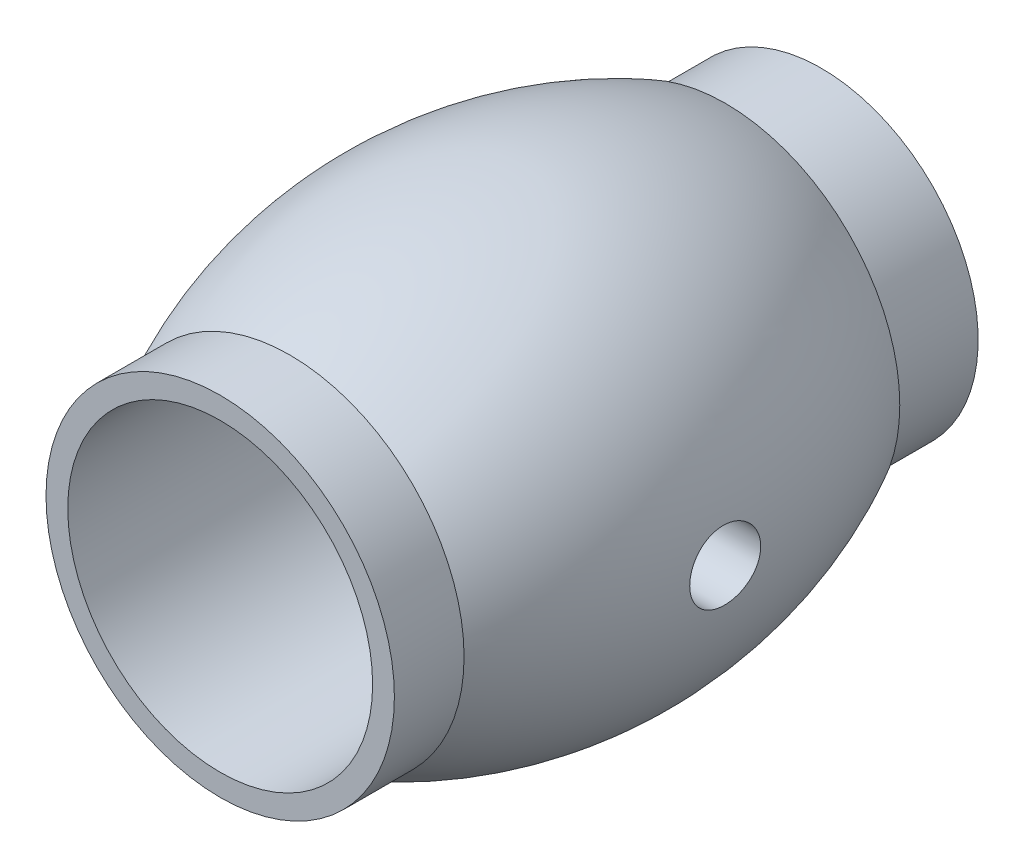
ISO-10303-21;
HEADER;
FILE_DESCRIPTION(('STEP AP214'),'2;1');
FILE_NAME('part.step','',(''),(''),'','','');
FILE_SCHEMA(('AUTOMOTIVE_DESIGN { 1 0 10303 214 1 1 1 1 }'));
ENDSEC;
DATA;
#1=APPLICATION_CONTEXT('core data for automotive mechanical design processes');
#2=APPLICATION_PROTOCOL_DEFINITION('international standard','automotive_design',2000,#1);
#3=PRODUCT_CONTEXT('',#1,'mechanical');
#4=PRODUCT('Part','Part','',(#3));
#5=PRODUCT_RELATED_PRODUCT_CATEGORY('part','',(#4));
#6=PRODUCT_DEFINITION_FORMATION('','',#4);
#7=PRODUCT_DEFINITION_CONTEXT('part definition',#1,'design');
#8=PRODUCT_DEFINITION('design','',#6,#7);
#9=PRODUCT_DEFINITION_SHAPE('','',#8);
#10=(LENGTH_UNIT() NAMED_UNIT(*) SI_UNIT(.MILLI.,.METRE.));
#11=(NAMED_UNIT(*) PLANE_ANGLE_UNIT() SI_UNIT($,.RADIAN.));
#12=(NAMED_UNIT(*) SI_UNIT($,.STERADIAN.) SOLID_ANGLE_UNIT());
#13=UNCERTAINTY_MEASURE_WITH_UNIT(LENGTH_MEASURE(1.E-05),#10,'distance_accuracy_value','');
#14=(GEOMETRIC_REPRESENTATION_CONTEXT(3) GLOBAL_UNCERTAINTY_ASSIGNED_CONTEXT((#13)) GLOBAL_UNIT_ASSIGNED_CONTEXT((#10,
#11,#12)) REPRESENTATION_CONTEXT('',''));
#15=CARTESIAN_POINT('',(0.,0.,0.));
#16=DIRECTION('',(0.,0.,1.));
#17=DIRECTION('',(1.,0.,0.));
#18=AXIS2_PLACEMENT_3D('',#15,#16,#17);
#19=CARTESIAN_POINT('',(0.,0.,-87.661385827459));
#20=DIRECTION('',(0.,0.,1.));
#21=DIRECTION('',(1.,0.,0.));
#22=AXIS2_PLACEMENT_3D('',#19,#20,#21);
#23=CYLINDRICAL_SURFACE('',#22,22.86);
#24=CARTESIAN_POINT('',(0.,0.,-87.661385827459));
#25=DIRECTION('',(0.,0.,-1.));
#26=DIRECTION('',(-1.,0.,0.));
#27=AXIS2_PLACEMENT_3D('',#24,#25,#26);
#28=CIRCLE('',#27,22.86);
#29=CARTESIAN_POINT('',(-22.86,0.,-87.661385827459));
#30=VERTEX_POINT('',#29);
#31=EDGE_CURVE('E11',#30,#30,#28,.T.);
#32=ORIENTED_EDGE('',*,*,#31,.F.);
#33=EDGE_LOOP('',(#32));
#34=FACE_BOUND('',#33,.T.);
#35=CARTESIAN_POINT('',(0.,0.,-73.691385827459));
#36=DIRECTION('',(0.,0.,-1.));
#37=DIRECTION('',(-1.,0.,0.));
#38=AXIS2_PLACEMENT_3D('',#35,#36,#37);
#39=CIRCLE('',#38,22.86);
#40=CARTESIAN_POINT('',(-22.86,0.,-73.691385827459));
#41=VERTEX_POINT('',#40);
#42=EDGE_CURVE('E57',#41,#41,#39,.T.);
#43=ORIENTED_EDGE('',*,*,#42,.T.);
#44=EDGE_LOOP('',(#43));
#45=FACE_BOUND('',#44,.T.);
#46=ADVANCED_FACE('F50',(#34,#45),#23,.T.);
#47=CARTESIAN_POINT('',(0.,0.,-87.661385827459));
#48=DIRECTION('',(0.,0.,-1.));
#49=DIRECTION('',(-1.,0.,0.));
#50=AXIS2_PLACEMENT_3D('',#47,#48,#49);
#51=PLANE('',#50);
#52=CARTESIAN_POINT('',(0.,0.,-87.661385827459));
#53=DIRECTION('',(0.,0.,-1.));
#54=DIRECTION('',(-1.,0.,0.));
#55=AXIS2_PLACEMENT_3D('',#52,#53,#54);
#56=CIRCLE('',#55,22.225);
#57=CARTESIAN_POINT('',(-22.225,0.,-87.661385827459));
#58=VERTEX_POINT('',#57);
#59=EDGE_CURVE('E63',#58,#58,#56,.T.);
#60=ORIENTED_EDGE('',*,*,#59,.F.);
#61=EDGE_LOOP('',(#60));
#62=FACE_BOUND('',#61,.T.);
#63=ORIENTED_EDGE('',*,*,#31,.T.);
#64=EDGE_LOOP('',(#63));
#65=FACE_BOUND('',#64,.T.);
#66=ADVANCED_FACE('F79',(#62,#65),#51,.T.);
#67=CARTESIAN_POINT('',(0.,0.,-73.691385827459));
#68=DIRECTION('',(0.,0.,-1.));
#69=DIRECTION('',(-1.,0.,0.));
#70=AXIS2_PLACEMENT_3D('',#67,#68,#69);
#71=PLANE('',#70);
#72=CARTESIAN_POINT('',(0.,0.,-73.691385827459));
#73=DIRECTION('',(0.,0.,-1.));
#74=DIRECTION('',(-1.,0.,0.));
#75=AXIS2_PLACEMENT_3D('',#72,#73,#74);
#76=CIRCLE('',#75,22.225);
#77=CARTESIAN_POINT('',(-22.225,0.,-73.691385827459));
#78=VERTEX_POINT('',#77);
#79=EDGE_CURVE('E53',#78,#78,#76,.T.);
#80=ORIENTED_EDGE('',*,*,#79,.T.);
#81=EDGE_LOOP('',(#80));
#82=FACE_BOUND('',#81,.T.);
#83=ORIENTED_EDGE('',*,*,#42,.F.);
#84=EDGE_LOOP('',(#83));
#85=FACE_BOUND('',#84,.T.);
#86=ADVANCED_FACE('F70',(#82,#85),#71,.F.);
#87=CARTESIAN_POINT('',(0.,0.,0.));
#88=DIRECTION('',(0.,0.,-1.));
#89=DIRECTION('',(-1.,0.,0.));
#90=AXIS2_PLACEMENT_3D('',#87,#88,#89);
#91=CYLINDRICAL_SURFACE('',#90,22.225);
#92=CARTESIAN_POINT('',(-22.225,0.,-87.661385827459));
#93=CARTESIAN_POINT('',(-22.225,0.,-87.5158649941257));
#94=CARTESIAN_POINT('',(-22.225,0.,-87.3703441607924));
#95=CARTESIAN_POINT('',(-22.225,0.,-87.0793024941257));
#96=CARTESIAN_POINT('',(-22.225,0.,-86.9337816607924));
#97=CARTESIAN_POINT('',(-22.225,0.,-86.6427399941257));
#98=CARTESIAN_POINT('',(-22.225,0.,-86.4972191607924));
#99=CARTESIAN_POINT('',(-22.225,0.,-86.2061774941257));
#100=CARTESIAN_POINT('',(-22.225,0.,-86.0606566607924));
#101=CARTESIAN_POINT('',(-22.225,0.,-85.7696149941257));
#102=CARTESIAN_POINT('',(-22.225,0.,-85.6240941607924));
#103=CARTESIAN_POINT('',(-22.225,0.,-85.3330524941257));
#104=CARTESIAN_POINT('',(-22.225,0.,-85.1875316607924));
#105=CARTESIAN_POINT('',(-22.225,0.,-84.8964899941257));
#106=CARTESIAN_POINT('',(-22.225,0.,-84.7509691607924));
#107=CARTESIAN_POINT('',(-22.225,0.,-84.4599274941257));
#108=CARTESIAN_POINT('',(-22.225,0.,-84.3144066607924));
#109=CARTESIAN_POINT('',(-22.225,0.,-84.0233649941257));
#110=CARTESIAN_POINT('',(-22.225,0.,-83.8778441607924));
#111=CARTESIAN_POINT('',(-22.225,0.,-83.5868024941257));
#112=CARTESIAN_POINT('',(-22.225,0.,-83.4412816607924));
#113=CARTESIAN_POINT('',(-22.225,0.,-83.1502399941257));
#114=CARTESIAN_POINT('',(-22.225,0.,-83.0047191607924));
#115=CARTESIAN_POINT('',(-22.225,0.,-82.7136774941257));
#116=CARTESIAN_POINT('',(-22.225,0.,-82.5681566607924));
#117=CARTESIAN_POINT('',(-22.225,0.,-82.2771149941257));
#118=CARTESIAN_POINT('',(-22.225,0.,-82.1315941607924));
#119=CARTESIAN_POINT('',(-22.225,0.,-81.8405524941257));
#120=CARTESIAN_POINT('',(-22.225,0.,-81.6950316607924));
#121=CARTESIAN_POINT('',(-22.225,0.,-81.4039899941257));
#122=CARTESIAN_POINT('',(-22.225,0.,-81.2584691607924));
#123=CARTESIAN_POINT('',(-22.225,0.,-80.9674274941257));
#124=CARTESIAN_POINT('',(-22.225,0.,-80.8219066607924));
#125=CARTESIAN_POINT('',(-22.225,0.,-80.5308649941257));
#126=CARTESIAN_POINT('',(-22.225,0.,-80.3853441607924));
#127=CARTESIAN_POINT('',(-22.225,0.,-80.0943024941257));
#128=CARTESIAN_POINT('',(-22.225,0.,-79.9487816607924));
#129=CARTESIAN_POINT('',(-22.225,0.,-79.6577399941257));
#130=CARTESIAN_POINT('',(-22.225,0.,-79.5122191607924));
#131=CARTESIAN_POINT('',(-22.225,0.,-79.2211774941257));
#132=CARTESIAN_POINT('',(-22.225,0.,-79.0756566607924));
#133=CARTESIAN_POINT('',(-22.225,0.,-78.7846149941257));
#134=CARTESIAN_POINT('',(-22.225,0.,-78.6390941607924));
#135=CARTESIAN_POINT('',(-22.225,0.,-78.3480524941257));
#136=CARTESIAN_POINT('',(-22.225,0.,-78.2025316607924));
#137=CARTESIAN_POINT('',(-22.225,0.,-77.9114899941257));
#138=CARTESIAN_POINT('',(-22.225,0.,-77.7659691607924));
#139=CARTESIAN_POINT('',(-22.225,0.,-77.4749274941257));
#140=CARTESIAN_POINT('',(-22.225,0.,-77.3294066607924));
#141=CARTESIAN_POINT('',(-22.225,0.,-77.0383649941257));
#142=CARTESIAN_POINT('',(-22.225,0.,-76.8928441607924));
#143=CARTESIAN_POINT('',(-22.225,0.,-76.6018024941257));
#144=CARTESIAN_POINT('',(-22.225,0.,-76.4562816607924));
#145=CARTESIAN_POINT('',(-22.225,0.,-76.1652399941257));
#146=CARTESIAN_POINT('',(-22.225,0.,-76.0197191607924));
#147=CARTESIAN_POINT('',(-22.225,0.,-75.7286774941257));
#148=CARTESIAN_POINT('',(-22.225,0.,-75.5831566607924));
#149=CARTESIAN_POINT('',(-22.225,0.,-75.2921149941257));
#150=CARTESIAN_POINT('',(-22.225,0.,-75.1465941607924));
#151=CARTESIAN_POINT('',(-22.225,0.,-74.8555524941257));
#152=CARTESIAN_POINT('',(-22.225,0.,-74.7100316607924));
#153=CARTESIAN_POINT('',(-22.225,0.,-74.4189899941257));
#154=CARTESIAN_POINT('',(-22.225,0.,-74.2734691607924));
#155=CARTESIAN_POINT('',(-22.225,0.,-73.9824274941257));
#156=CARTESIAN_POINT('',(-22.225,0.,-73.8369066607924));
#157=CARTESIAN_POINT('',(-22.225,0.,-73.691385827459));
#158=B_SPLINE_CURVE_WITH_KNOTS('',3,(#92,#93,#94,#95,#96,#97,#98,#99,#100,#101,#102,#103,#104,
#105,#106,#107,#108,#109,#110,#111,#112,#113,#114,#115,#116,#117,#118,#119,#120,#121,#122,#123,
#124,#125,#126,#127,#128,#129,#130,#131,#132,#133,#134,#135,#136,#137,#138,#139,#140,#141,#142,
#143,#144,#145,#146,#147,#148,#149,#150,#151,#152,#153,#154,#155,#156,#157),.UNSPECIFIED.,.F.,
.F.,(4,2,2,2,2,2,2,2,2,2,2,2,2,2,2,2,2,2,2,2,2,2,2,2,2,2,2,2,2,2,2,2,4),(0.,0.436562500000001,
0.873125000000002,1.3096875,1.74625,2.18281250000001,2.61937500000001,3.05593750000001,
3.49250000000001,3.9290625,4.365625,4.8021875,5.23875,5.6753125,6.111875,6.5484375,6.985,
7.42156250000001,7.85812500000001,8.29468750000001,8.73125000000001,9.16781250000001,
9.60437500000001,10.0409375,10.4775,10.9140625,11.350625,11.7871875,12.22375,12.6603125,
13.096875,13.5334375,13.97),.UNSPECIFIED.);
#159=EDGE_CURVE('BSEAM73',#58,#78,#158,.T.);
#160=ORIENTED_EDGE('',*,*,#59,.T.);
#161=ORIENTED_EDGE('',*,*,#79,.F.);
#162=ORIENTED_EDGE('',*,*,#159,.T.);
#163=ORIENTED_EDGE('',*,*,#159,.F.);
#164=EDGE_LOOP('',(#160,#162,#161,#163));
#165=FACE_BOUND('',#164,.T.);
#166=ADVANCED_FACE('F73',(#165),#91,.F.);
#167=CLOSED_SHELL('',(#46,#66,#86,#166));
#168=MANIFOLD_SOLID_BREP('B2',#167);
#169=CARTESIAN_POINT('',(0.,0.,-10.16));
#170=DIRECTION('',(0.,0.,1.));
#171=DIRECTION('',(1.,0.,0.));
#172=AXIS2_PLACEMENT_3D('',#169,#170,#171);
#173=CYLINDRICAL_SURFACE('',#172,25.4);
#174=CARTESIAN_POINT('',(0.,0.,-10.16));
#175=DIRECTION('',(0.,0.,1.));
#176=DIRECTION('',(1.,0.,0.));
#177=AXIS2_PLACEMENT_3D('',#174,#175,#176);
#178=CIRCLE('',#177,25.4);
#179=CARTESIAN_POINT('',(25.4,0.,-10.16));
#180=VERTEX_POINT('',#179);
#181=EDGE_CURVE('E130',#180,#180,#178,.T.);
#182=ORIENTED_EDGE('',*,*,#181,.T.);
#183=EDGE_LOOP('',(#182));
#184=FACE_BOUND('',#183,.T.);
#185=CARTESIAN_POINT('',(0.,0.,0.));
#186=DIRECTION('',(0.,0.,1.));
#187=DIRECTION('',(1.,0.,0.));
#188=AXIS2_PLACEMENT_3D('',#185,#186,#187);
#189=CIRCLE('',#188,25.4);
#190=CARTESIAN_POINT('',(25.4,0.,0.));
#191=VERTEX_POINT('',#190);
#192=EDGE_CURVE('E49',#191,#191,#189,.T.);
#193=ORIENTED_EDGE('',*,*,#192,.F.);
#194=EDGE_LOOP('',(#193));
#195=FACE_BOUND('',#194,.T.);
#196=ADVANCED_FACE('F111',(#184,#195),#173,.T.);
#197=CARTESIAN_POINT('',(0.,0.,0.));
#198=DIRECTION('',(0.,0.,1.));
#199=DIRECTION('',(1.,0.,0.));
#200=AXIS2_PLACEMENT_3D('',#197,#198,#199);
#201=PLANE('',#200);
#202=CARTESIAN_POINT('',(0.,0.,0.));
#203=DIRECTION('',(0.,0.,1.));
#204=DIRECTION('',(1.,0.,0.));
#205=AXIS2_PLACEMENT_3D('',#202,#203,#204);
#206=CIRCLE('',#205,22.225);
#207=CARTESIAN_POINT('',(22.225,0.,0.));
#208=VERTEX_POINT('',#207);
#209=EDGE_CURVE('E180',#208,#208,#206,.T.);
#210=ORIENTED_EDGE('',*,*,#209,.F.);
#211=EDGE_LOOP('',(#210));
#212=FACE_BOUND('',#211,.T.);
#213=ORIENTED_EDGE('',*,*,#192,.T.);
#214=EDGE_LOOP('',(#213));
#215=FACE_BOUND('',#214,.T.);
#216=ADVANCED_FACE('F168',(#212,#215),#201,.T.);
#217=CARTESIAN_POINT('',(0.,0.,-41.9256929137295));
#218=DIRECTION('',(0.,0.,1.));
#219=DIRECTION('',(1.,0.,0.));
#220=AXIS2_PLACEMENT_3D('',#217,#218,#219);
#221=DEGENERATE_TOROIDAL_SURFACE('',#220,35.3795784265623,68.58,.F.);
#222=CARTESIAN_POINT('',(-33.0130739266837,-2.89140779723996,-44.8168601784187));
#223=CARTESIAN_POINT('',(-33.0198908590683,-2.77440655040434,-44.8978551930183));
#224=CARTESIAN_POINT('',(-33.0264451045919,-2.6540059141496,-44.9739256980847));
#225=CARTESIAN_POINT('',(-33.0388790893021,-2.40717893275756,-45.1157285484556));
#226=CARTESIAN_POINT('',(-33.0447586667074,-2.28075115259416,-45.1814584155369));
#227=CARTESIAN_POINT('',(-33.0557059969761,-2.02269248227111,-45.3021263696417));
#228=CARTESIAN_POINT('',(-33.0607731009745,-1.89105753707689,-45.357055838995));
#229=CARTESIAN_POINT('',(-33.069970805516,-1.62355740397118,-45.4556815337727));
#230=CARTESIAN_POINT('',(-33.0741010658293,-1.48769069953535,-45.4993736789492));
#231=CARTESIAN_POINT('',(-33.0813211296492,-1.21282618370895,-45.5751558437681));
#232=CARTESIAN_POINT('',(-33.0844115994482,-1.07383043855687,-45.6072532942058));
#233=CARTESIAN_POINT('',(-33.0894821826878,-0.793560809355509,-45.6596606400304));
#234=CARTESIAN_POINT('',(-33.0914618863399,-0.652286104290409,-45.6799661851939));
#235=CARTESIAN_POINT('',(-33.094260406369,-0.368604105537237,-45.7086134967836));
#236=CARTESIAN_POINT('',(-33.0950799265178,-0.226197551205893,-45.7169625161206));
#237=CARTESIAN_POINT('',(-33.0955405713848,0.0588679506116681,-45.72165947741));
#238=CARTESIAN_POINT('',(-33.0951812617875,0.201526971762725,-45.7180029961844));
#239=CARTESIAN_POINT('',(-33.0932946884907,0.485621647673346,-45.6987335070701));
#240=CARTESIAN_POINT('',(-33.0917707300092,0.627059620961329,-45.6831543350345));
#241=CARTESIAN_POINT('',(-33.0875947335041,0.908166514854154,-45.6401857824085));
#242=CARTESIAN_POINT('',(-33.084942280105,1.04783476454754,-45.6127920530726));
#243=CARTESIAN_POINT('',(-33.0785740254225,1.32431246312791,-45.5464041456292));
#244=CARTESIAN_POINT('',(-33.0748585764044,1.4611228429928,-45.5074138103432));
#245=CARTESIAN_POINT('',(-33.0664512949954,1.73101606822113,-45.4180954646805));
#246=CARTESIAN_POINT('',(-33.0617591016802,1.86409751499437,-45.3677632627138));
#247=CARTESIAN_POINT('',(-33.0515083357815,2.1256064284102,-45.2561043758834));
#248=CARTESIAN_POINT('',(-33.0459493496054,2.25403163707192,-45.1947724403541));
#249=CARTESIAN_POINT('',(-33.0340961700725,2.50530410689886,-45.0615477010832));
#250=CARTESIAN_POINT('',(-33.0278017064585,2.62814929446521,-44.9896510127183));
#251=CARTESIAN_POINT('',(-33.0146286345407,2.86731829066866,-44.8358411340637));
#252=CARTESIAN_POINT('',(-33.0077502304351,2.983644355548,-44.7539314408506));
#253=CARTESIAN_POINT('',(-32.99356747464,3.20902252410367,-44.5806620897802));
#254=CARTESIAN_POINT('',(-32.986262966124,3.31807191756102,-44.4892989429137));
#255=CARTESIAN_POINT('',(-32.9639043893602,3.63392356108231,-44.2012118343957));
#256=CARTESIAN_POINT('',(-32.9484484346408,3.82867271584181,-43.9909773960849));
#257=CARTESIAN_POINT('',(-32.9179001745085,4.18004296668688,-43.5409081690271));
#258=CARTESIAN_POINT('',(-32.9028078733548,4.33666361640443,-43.3010730337962));
#259=CARTESIAN_POINT('',(-32.8742671412942,4.60777317311,-42.7979155135039));
#260=CARTESIAN_POINT('',(-32.860822010726,4.72217838884974,-42.534547745103));
#261=CARTESIAN_POINT('',(-32.8367199451189,4.90508151257545,-41.9922147639142));
#262=CARTESIAN_POINT('',(-32.8260629678046,4.97358011664677,-41.7132497876975));
#263=CARTESIAN_POINT('',(-32.8083302063953,5.06256147434866,-41.1483514547443));
#264=CARTESIAN_POINT('',(-32.80124570531,5.08316155070656,-40.8624368616462));
#265=CARTESIAN_POINT('',(-32.7909738519424,5.07605187818183,-40.2911412005723));
#266=CARTESIAN_POINT('',(-32.7877864256182,5.0483430471621,-40.0057601225631));
#267=CARTESIAN_POINT('',(-32.7852239953296,4.94554207087491,-39.4445237931016));
#268=CARTESIAN_POINT('',(-32.785837739531,4.87059036021075,-39.1686428559452));
#269=CARTESIAN_POINT('',(-32.7903464252715,4.67556412746428,-38.6333498845095));
#270=CARTESIAN_POINT('',(-32.7942413802389,4.55548942071744,-38.3739379176341));
#271=CARTESIAN_POINT('',(-32.8044647910859,4.27356600648417,-37.8787983849985));
#272=CARTESIAN_POINT('',(-32.8107943960713,4.11169758508285,-37.6430820694732));
#273=CARTESIAN_POINT('',(-32.8247999805953,3.75079621829388,-37.2021070403812));
#274=CARTESIAN_POINT('',(-32.8324759802112,3.55176271870172,-36.9968487810862));
#275=CARTESIAN_POINT('',(-32.8480038209813,3.12163378812073,-36.6221212946285));
#276=CARTESIAN_POINT('',(-32.8558560318815,2.89046435363547,-36.4527370184674));
#277=CARTESIAN_POINT('',(-32.8705625882016,2.40295040490589,-36.1551605724245));
#278=CARTESIAN_POINT('',(-32.8774169327682,2.14660586913493,-36.0269684377656));
#279=CARTESIAN_POINT('',(-32.8891513176373,1.61590452607294,-35.8153880251035));
#280=CARTESIAN_POINT('',(-32.8940306981624,1.34154173493017,-35.7320147167051));
#281=CARTESIAN_POINT('',(-32.9011265787874,0.782678665954479,-35.612529194694));
#282=CARTESIAN_POINT('',(-32.9033431107976,0.498178509644997,-35.5764164147331));
#283=CARTESIAN_POINT('',(-32.9048034959465,-0.0723734648393803,-35.5525102288129));
#284=CARTESIAN_POINT('',(-32.9040523210408,-0.358421886677479,-35.5646360064938));
#285=CARTESIAN_POINT('',(-32.8996926781874,-0.924413251382078,-35.6366768761995));
#286=CARTESIAN_POINT('',(-32.8960842134766,-1.20435620116488,-35.6965919140857));
#287=CARTESIAN_POINT('',(-32.8865144793408,-1.75008591011086,-35.8624579359748));
#288=CARTESIAN_POINT('',(-32.8805541361849,-2.01587819568856,-35.9683907978686));
#289=CARTESIAN_POINT('',(-32.8671199451412,-2.52592928198461,-36.2232878590354));
#290=CARTESIAN_POINT('',(-32.8596460800677,-2.77018783814792,-36.3722525469316));
#291=CARTESIAN_POINT('',(-32.844250257449,-3.23063871969187,-36.709230452821));
#292=CARTESIAN_POINT('',(-32.8363275929293,-3.44678489050746,-36.8973066002836));
#293=CARTESIAN_POINT('',(-32.8212370257307,-3.84453332177149,-37.3072231873611));
#294=CARTESIAN_POINT('',(-32.8140691272903,-4.02613538823725,-37.5290638165681));
#295=CARTESIAN_POINT('',(-32.8047569506197,-4.2686299420723,-37.8821543928109));
#296=CARTESIAN_POINT('',(-32.8018910937266,-4.34452621885258,-38.0033463659948));
#297=CARTESIAN_POINT('',(-32.7967676007622,-4.48583843740922,-38.2516899461796));
#298=CARTESIAN_POINT('',(-32.7945097394295,-4.55125825704397,-38.3788393254171));
#299=CARTESIAN_POINT('',(-32.7907174954219,-4.67116893106995,-38.6382465573951));
#300=CARTESIAN_POINT('',(-32.7891833739319,-4.725655835894,-38.7705062357522));
#301=CARTESIAN_POINT('',(-32.7869368218512,-4.82327147714267,-39.0391065847088));
#302=CARTESIAN_POINT('',(-32.7862240852283,-4.86640443920208,-39.1754457159457));
#303=CARTESIAN_POINT('',(-32.7856948792029,-4.94096525539314,-39.4510472225622));
#304=CARTESIAN_POINT('',(-32.7858769318059,-4.97241231967259,-39.5903043992776));
#305=CARTESIAN_POINT('',(-32.7871839475612,-5.02346861663269,-39.8709146050311));
#306=CARTESIAN_POINT('',(-32.788308560486,-5.04308224161124,-40.0122668364485));
#307=CARTESIAN_POINT('',(-32.7915248507177,-5.07035612632146,-40.296154870153));
#308=CARTESIAN_POINT('',(-32.7936168395021,-5.07801253256553,-40.4386910391193));
#309=CARTESIAN_POINT('',(-32.7987638641045,-5.08130827101071,-40.7238321002037));
#310=CARTESIAN_POINT('',(-32.8018185441957,-5.07695203743614,-40.8664369475411));
#311=CARTESIAN_POINT('',(-32.808856252012,-5.05628074061056,-41.1505796707839));
#312=CARTESIAN_POINT('',(-32.812838148011,-5.03998020448618,-41.2921186319839));
#313=CARTESIAN_POINT('',(-32.8216733639846,-4.99556696599009,-41.5732497768782));
#314=CARTESIAN_POINT('',(-32.82652636338,-4.96745860399354,-41.7128426564614));
#315=CARTESIAN_POINT('',(-32.837025404947,-4.89961529395368,-41.9892334571106));
#316=CARTESIAN_POINT('',(-32.8426719276965,-4.85987328436374,-42.1260296264789));
#317=CARTESIAN_POINT('',(-32.8546476324592,-4.76907350232221,-42.3957266539454));
#318=CARTESIAN_POINT('',(-32.86097656555,-4.71801984889168,-42.5286289100781));
#319=CARTESIAN_POINT('',(-32.8742116490968,-4.60478998442759,-42.7900363371636));
#320=CARTESIAN_POINT('',(-32.8811194170564,-4.5425820114426,-42.9185276694557));
#321=CARTESIAN_POINT('',(-32.8953489295178,-4.40761306974687,-43.1697576809176));
#322=CARTESIAN_POINT('',(-32.9026705239253,-4.33485591241603,-43.2924984166543));
#323=CARTESIAN_POINT('',(-32.9175660622159,-4.17934695005043,-43.5313224348534));
#324=CARTESIAN_POINT('',(-32.9251397988119,-4.09660321493052,-43.6474109823804));
#325=CARTESIAN_POINT('',(-32.9403754499003,-3.92168834541215,-43.872188399914));
#326=CARTESIAN_POINT('',(-32.9480373426994,-3.82951948808139,-43.9808790467009));
#327=CARTESIAN_POINT('',(-32.9656230067427,-3.60667478218351,-44.2223080985719));
#328=CARTESIAN_POINT('',(-32.9755186289287,-3.47286722075664,-44.3521778409247));
#329=CARTESIAN_POINT('',(-32.9947840689422,-3.19178255770914,-44.5964624121055));
#330=CARTESIAN_POINT('',(-33.004153884723,-3.04450540366358,-44.7108771807771));
#331=CARTESIAN_POINT('',(-33.0130739266837,-2.89140779723996,-44.8168601784187));
#332=B_SPLINE_CURVE_WITH_KNOTS('',3,(#222,#223,#224,#225,#226,#227,#228,#229,#230,#231,#232,
#233,#234,#235,#236,#237,#238,#239,#240,#241,#242,#243,#244,#245,#246,#247,#248,#249,#250,#251,
#252,#253,#254,#255,#256,#257,#258,#259,#260,#261,#262,#263,#264,#265,#266,#267,#268,#269,#270,
#271,#272,#273,#274,#275,#276,#277,#278,#279,#280,#281,#282,#283,#284,#285,#286,#287,#288,#289,
#290,#291,#292,#293,#294,#295,#296,#297,#298,#299,#300,#301,#302,#303,#304,#305,#306,#307,#308,
#309,#310,#311,#312,#313,#314,#315,#316,#317,#318,#319,#320,#321,#322,#323,#324,#325,#326,#327,
#328,#329,#330,#331),.UNSPECIFIED.,.T.,.F.,(4,2,2,2,2,2,2,2,2,2,2,2,2,2,2,2,2,2,2,2,2,2,2,2,2,2,
2,2,2,2,2,2,2,2,2,2,2,2,2,2,2,2,2,2,2,2,2,2,2,2,2,2,2,2,4),(0.,0.427230391912612,
0.854563017814096,1.28223524224444,1.71006253499025,2.13761515375487,2.56532540351561,
2.99277609123599,3.42038428197661,3.84678342692984,4.27333965657385,4.69975469347837,
5.12632757890847,5.55310463127712,5.98003900260627,6.40682468936669,6.83376845663287,
7.69032486905599,8.54689130864946,9.40514686495734,10.2633894071785,11.1195275441496,
11.9756494147854,12.8292382950909,13.6828306687215,14.5368264161145,15.3908348992829,
16.2468436388917,17.1028531104599,17.9591483140577,18.8154332561182,19.6702842277646,
20.525134230983,21.3796478936333,22.2341712596056,23.0900803226283,23.9459941918732,
24.3746488336858,24.8031444404917,25.2317945657652,25.6602849326085,26.0880677660059,
26.5156917185054,26.9434534542005,27.371057311395,27.7981419615071,28.2250697590523,
28.6522572381874,29.0792894162205,29.5075574591436,29.9356711542574,30.3634411884637,
30.7911081184056,31.350142296062,31.9091786496244),.UNSPECIFIED.);
#333=CARTESIAN_POINT('',(-33.0130739266837,-2.89140779723996,-44.8168601784187));
#334=VERTEX_POINT('',#333);
#335=EDGE_CURVE('E159',#334,#334,#332,.T.);
#336=ORIENTED_EDGE('',*,*,#335,.T.);
#337=EDGE_LOOP('',(#336));
#338=FACE_BOUND('',#337,.T.);
#339=CARTESIAN_POINT('',(33.0130739266837,-2.89140779723996,-44.8168601784187));
#340=CARTESIAN_POINT('',(33.0062277014299,-3.00891719246991,-44.7355163702836));
#341=CARTESIAN_POINT('',(32.9991183973398,-3.12296528118828,-44.6492279138528));
#342=CARTESIAN_POINT('',(32.9845364265901,-3.34340618330713,-44.4673300092186));
#343=CARTESIAN_POINT('',(32.9770636677628,-3.44979703778516,-44.3717181904811));
#344=CARTESIAN_POINT('',(32.9619234038821,-3.65422019731009,-44.1717891677128));
#345=CARTESIAN_POINT('',(32.9542557357718,-3.75224518355887,-44.0674644960172));
#346=CARTESIAN_POINT('',(32.9389044175369,-3.93917914464775,-43.8508780535687));
#347=CARTESIAN_POINT('',(32.9312207625925,-4.02808477220519,-43.7386133937876));
#348=CARTESIAN_POINT('',(32.9160196060581,-4.19604071731436,-43.5070684570712));
#349=CARTESIAN_POINT('',(32.9085019747595,-4.27509896981107,-43.3877939442062));
#350=CARTESIAN_POINT('',(32.8937894253155,-4.42291041582579,-43.1429424546258));
#351=CARTESIAN_POINT('',(32.8865946271098,-4.49165980122798,-43.0173631716694));
#352=CARTESIAN_POINT('',(32.8726896290602,-4.61828761447722,-42.7609096180732));
#353=CARTESIAN_POINT('',(32.8659791315967,-4.67617275440157,-42.6300386778458));
#354=CARTESIAN_POINT('',(32.8531744826481,-4.78072746981686,-42.3638054427178));
#355=CARTESIAN_POINT('',(32.8470805589438,-4.82739290911267,-42.2284415123202));
#356=CARTESIAN_POINT('',(32.8356384623935,-4.90909579556365,-41.9543825831377));
#357=CARTESIAN_POINT('',(32.8302894654867,-4.94414615187644,-41.8156914674003));
#358=CARTESIAN_POINT('',(32.8204250755779,-5.00244414504255,-41.5357673103581));
#359=CARTESIAN_POINT('',(32.815909991457,-5.02568741411261,-41.3945333483567));
#360=CARTESIAN_POINT('',(32.8077904609979,-5.06017251697932,-41.1106317233597));
#361=CARTESIAN_POINT('',(32.8041856975287,-5.07141853470845,-40.9679645777059));
#362=CARTESIAN_POINT('',(32.7979301806789,-5.08183907463805,-40.6821163879814));
#363=CARTESIAN_POINT('',(32.7952797791398,-5.08100914950082,-40.538935173998));
#364=CARTESIAN_POINT('',(32.7909621385817,-5.0672941362318,-40.2536833271235));
#365=CARTESIAN_POINT('',(32.7892911910656,-5.0544550043653,-40.1116105413286));
#366=CARTESIAN_POINT('',(32.7869075005911,-5.01687102390685,-39.8289895790311));
#367=CARTESIAN_POINT('',(32.7861951108842,-4.99212179071801,-39.6884419835138));
#368=CARTESIAN_POINT('',(32.7856946934842,-4.93089531514508,-39.4099687957756));
#369=CARTESIAN_POINT('',(32.7859063168895,-4.89442250433051,-39.2720422336233));
#370=CARTESIAN_POINT('',(32.7871905149735,-4.81001801968959,-38.9997300253126));
#371=CARTESIAN_POINT('',(32.7882634077345,-4.76208211693023,-38.86534570631));
#372=CARTESIAN_POINT('',(32.7926519893069,-4.60168190684274,-38.4693372393878));
#373=CARTESIAN_POINT('',(32.7971371548253,-4.47249423903137,-38.2142652498515));
#374=CARTESIAN_POINT('',(32.8083259829862,-4.17333816058673,-37.7295205377399));
#375=CARTESIAN_POINT('',(32.8150296725073,-4.00336925587627,-37.4998481229377));
#376=CARTESIAN_POINT('',(32.8295515927946,-3.62699969821395,-37.0717191419368));
#377=CARTESIAN_POINT('',(32.8373721353921,-3.42052325994861,-36.8733291672875));
#378=CARTESIAN_POINT('',(32.8529202636709,-2.97722667678264,-36.5139909489575));
#379=CARTESIAN_POINT('',(32.8606478484817,-2.74040624793462,-36.353043055685));
#380=CARTESIAN_POINT('',(32.8748933030631,-2.24273962322817,-36.0729263723489));
#381=CARTESIAN_POINT('',(32.8814094279656,-1.98185957046188,-35.9538176271864));
#382=CARTESIAN_POINT('',(32.8922911935499,-1.44376000342334,-35.7611036729276));
#383=CARTESIAN_POINT('',(32.8966568550753,-1.16654064755054,-35.6874980227865));
#384=CARTESIAN_POINT('',(32.9026223296474,-0.603987281393235,-35.587961459329));
#385=CARTESIAN_POINT('',(32.9042254786889,-0.318663482038803,-35.5619730413008));
#386=CARTESIAN_POINT('',(32.9044535379819,0.252298988137736,-35.5582437054027));
#387=CARTESIAN_POINT('',(32.9030784712278,0.537937656511769,-35.580502415024));
#388=CARTESIAN_POINT('',(32.8975446406609,1.10104941307805,-35.6725677702966));
#389=CARTESIAN_POINT('',(32.8933893533525,1.37853224785619,-35.7423150361848));
#390=CARTESIAN_POINT('',(32.8828777463793,1.9178507273266,-35.9273020744108));
#391=CARTESIAN_POINT('',(32.8765214078537,2.17968623791347,-36.0425422365812));
#392=CARTESIAN_POINT('',(32.8624986399042,2.68058642100612,-36.3153868282272));
#393=CARTESIAN_POINT('',(32.8548308333751,2.9196267422622,-36.4730358898114));
#394=CARTESIAN_POINT('',(32.8393045736582,3.36788257522028,-36.8261855402369));
#395=CARTESIAN_POINT('',(32.8314461185117,3.57709778033913,-37.021686518123));
#396=CARTESIAN_POINT('',(32.8167253267219,3.96006191542674,-37.4453241325996));
#397=CARTESIAN_POINT('',(32.8098643900886,4.13376113518891,-37.6735057620251));
#398=CARTESIAN_POINT('',(32.7982928399267,4.44038552985867,-38.1558420782519));
#399=CARTESIAN_POINT('',(32.793582206898,4.57331107451968,-38.4099965294924));
#400=CARTESIAN_POINT('',(32.787254806184,4.79446011671043,-38.9367525225982));
#401=CARTESIAN_POINT('',(32.7856344552627,4.8827352997002,-39.2093323195813));
#402=CARTESIAN_POINT('',(32.7860932636367,5.01228907314763,-39.7654360953293));
#403=CARTESIAN_POINT('',(32.7881723620641,5.05356843682138,-40.0489598939545));
#404=CARTESIAN_POINT('',(32.7962321799093,5.08793273000275,-40.618215126532));
#405=CARTESIAN_POINT('',(32.8022041530621,5.08112536129543,-40.9039401961493));
#406=CARTESIAN_POINT('',(32.8178143500182,5.0197961497681,-41.4701277301027));
#407=CARTESIAN_POINT('',(32.8274525836035,4.96527417963864,-41.7505901803953));
#408=CARTESIAN_POINT('',(32.8497514782947,4.8100990115,-42.2984672535482));
#409=CARTESIAN_POINT('',(32.8624140318809,4.70941689217103,-42.5658735797887));
#410=CARTESIAN_POINT('',(32.8897651473086,4.46466988380282,-43.0801007468837));
#411=CARTESIAN_POINT('',(32.9044537598618,4.32060390877255,-43.3269210722289));
#412=CARTESIAN_POINT('',(32.9270677771452,4.07500761401903,-43.6766439752822));
#413=CARTESIAN_POINT('',(32.9347202115898,3.98800054231722,-43.7900283101831));
#414=CARTESIAN_POINT('',(32.9500424798043,3.80475956722562,-44.0090582746709));
#415=CARTESIAN_POINT('',(32.9577123061777,3.70852905387642,-44.1147067225603));
#416=CARTESIAN_POINT('',(32.9728986865297,3.50747312597031,-44.3175595302938));
#417=CARTESIAN_POINT('',(32.980415180799,3.40264444005606,-44.4147606469313));
#418=CARTESIAN_POINT('',(32.995116212893,3.18519576289481,-44.5999637480168));
#419=CARTESIAN_POINT('',(33.0023008725646,3.07257867003661,-44.6879691242924));
#420=CARTESIAN_POINT('',(33.0161857714358,2.84010483769684,-44.8543413156053));
#421=CARTESIAN_POINT('',(33.0228851269601,2.72023558665802,-44.9326907216473));
#422=CARTESIAN_POINT('',(33.0356244998157,2.47433171502553,-45.0789798259272));
#423=CARTESIAN_POINT('',(33.0416647613937,2.34829940358115,-45.1469233841516));
#424=CARTESIAN_POINT('',(33.0529465764752,2.09088007589571,-45.2719652545784));
#425=CARTESIAN_POINT('',(33.058187873028,1.95949135415471,-45.3290600792276));
#426=CARTESIAN_POINT('',(33.067741622226,1.692382791888,-45.4319427804102));
#427=CARTESIAN_POINT('',(33.0720544230846,1.55666459704488,-45.4777348967415));
#428=CARTESIAN_POINT('',(33.0796386028844,1.28221115636692,-45.5575910651186));
#429=CARTESIAN_POINT('',(33.082912908259,1.14348558694468,-45.5916880959046));
#430=CARTESIAN_POINT('',(33.0883566438392,0.863687512327015,-45.6480737562924));
#431=CARTESIAN_POINT('',(33.0905264871984,0.722615905153117,-45.6703668016169));
#432=CARTESIAN_POINT('',(33.093711495655,0.439001025521803,-45.703009546922));
#433=CARTESIAN_POINT('',(33.094725986173,0.29645694228156,-45.7133522694812));
#434=CARTESIAN_POINT('',(33.0955731913569,0.0110537039120237,-45.7219929834029));
#435=CARTESIAN_POINT('',(33.0954063454163,-0.131805314315657,-45.7202954530894));
#436=CARTESIAN_POINT('',(33.093898186284,-0.416448742328546,-45.704901324955));
#437=CARTESIAN_POINT('',(33.0925603181436,-0.55823507477633,-45.6912399237985));
#438=CARTESIAN_POINT('',(33.0887478394564,-0.840093186957368,-45.6520735501327));
#439=CARTESIAN_POINT('',(33.0862736452155,-0.980165575335502,-45.6265729150227));
#440=CARTESIAN_POINT('',(33.0802504910617,-1.25754199118297,-45.5639399306426));
#441=CARTESIAN_POINT('',(33.0767024230364,-1.39484821549445,-45.5268172330016));
#442=CARTESIAN_POINT('',(33.0686173821421,-1.66579690440593,-45.4412192785105));
#443=CARTESIAN_POINT('',(33.0640806531904,-1.7994402635491,-45.3927468215928));
#444=CARTESIAN_POINT('',(33.0527019976781,-2.09970196360025,-45.2693599140641));
#445=CARTESIAN_POINT('',(33.0455717092146,-2.26484407901811,-45.1908471989222));
#446=CARTESIAN_POINT('',(33.0301285650344,-2.58567451448697,-45.0165303204875));
#447=CARTESIAN_POINT('',(33.0218157094473,-2.74136283557329,-44.9207261590884));
#448=CARTESIAN_POINT('',(33.0130739266837,-2.89140779723996,-44.8168601784187));
#449=B_SPLINE_CURVE_WITH_KNOTS('',3,(#339,#340,#341,#342,#343,#344,#345,#346,#347,#348,#349,
#350,#351,#352,#353,#354,#355,#356,#357,#358,#359,#360,#361,#362,#363,#364,#365,#366,#367,#368,
#369,#370,#371,#372,#373,#374,#375,#376,#377,#378,#379,#380,#381,#382,#383,#384,#385,#386,#387,
#388,#389,#390,#391,#392,#393,#394,#395,#396,#397,#398,#399,#400,#401,#402,#403,#404,#405,#406,
#407,#408,#409,#410,#411,#412,#413,#414,#415,#416,#417,#418,#419,#420,#421,#422,#423,#424,#425,
#426,#427,#428,#429,#430,#431,#432,#433,#434,#435,#436,#437,#438,#439,#440,#441,#442,#443,#444,
#445,#446,#447,#448),.UNSPECIFIED.,.T.,.F.,(4,2,2,2,2,2,2,2,2,2,2,2,2,2,2,2,2,2,2,2,2,2,2,2,2,2,
2,2,2,2,2,2,2,2,2,2,2,2,2,2,2,2,2,2,2,2,2,2,2,2,2,2,2,2,4),(0.,0.429082953962694,
0.858275291328514,1.28783933467255,1.7175604905222,2.14693310872246,2.57646394932738,
3.0057285401138,3.43515113948019,3.86409485953603,4.29319714294207,4.72214973185365,
5.15126029975775,5.57873545664906,6.00636810521106,6.43383929626856,6.86146843279934,
7.7149298068765,8.56840152142229,9.42366620052544,10.278938883451,11.1354340325004,
11.9919208797234,12.8473727114342,13.7028179383537,14.5571954749099,15.4115803328586,
16.2668679070366,17.1221642723904,17.9786496861696,18.835127332737,19.6906112732716,
20.5460811384369,21.3996355818881,22.2531923027528,23.107284546011,23.9613981708088,
24.3903573021726,24.8191593714665,25.2481253512115,25.6769325451412,26.1065018748772,
26.5359114704933,26.9654588761539,27.3948449070919,27.8230099698207,28.2510147480144,
28.6792692987929,29.107364570353,29.5342046378661,29.9608884523105,30.3872188597274,
30.8134442040337,31.3613301182104,31.9092159723855),.UNSPECIFIED.);
#450=CARTESIAN_POINT('',(33.0130739266837,-2.89140779723996,-44.8168601784187));
#451=VERTEX_POINT('',#450);
#452=EDGE_CURVE('E152',#451,#451,#449,.T.);
#453=ORIENTED_EDGE('',*,*,#452,.T.);
#454=EDGE_LOOP('',(#453));
#455=FACE_BOUND('',#454,.T.);
#456=ORIENTED_EDGE('',*,*,#181,.F.);
#457=EDGE_LOOP('',(#456));
#458=FACE_BOUND('',#457,.T.);
#459=CARTESIAN_POINT('',(0.,0.,-73.691385827459));
#460=DIRECTION('',(0.,0.,1.));
#461=DIRECTION('',(1.,0.,0.));
#462=AXIS2_PLACEMENT_3D('',#459,#460,#461);
#463=CIRCLE('',#462,25.4);
#464=CARTESIAN_POINT('',(25.4,0.,-73.691385827459));
#465=VERTEX_POINT('',#464);
#466=EDGE_CURVE('E124',#465,#465,#463,.T.);
#467=ORIENTED_EDGE('',*,*,#466,.T.);
#468=EDGE_LOOP('',(#467));
#469=FACE_BOUND('',#468,.T.);
#470=ADVANCED_FACE('F164',(#338,#455,#458,#469),#221,.F.);
#471=CARTESIAN_POINT('',(0.,0.,-73.691385827459));
#472=DIRECTION('',(0.,0.,1.));
#473=DIRECTION('',(1.,0.,0.));
#474=AXIS2_PLACEMENT_3D('',#471,#472,#473);
#475=PLANE('',#474);
#476=CARTESIAN_POINT('',(0.,0.,-73.691385827459));
#477=DIRECTION('',(0.,0.,1.));
#478=DIRECTION('',(1.,0.,0.));
#479=AXIS2_PLACEMENT_3D('',#476,#477,#478);
#480=CIRCLE('',#479,22.225);
#481=CARTESIAN_POINT('',(22.225,0.,-73.691385827459));
#482=VERTEX_POINT('',#481);
#483=EDGE_CURVE('E183',#482,#482,#480,.T.);
#484=ORIENTED_EDGE('',*,*,#483,.T.);
#485=EDGE_LOOP('',(#484));
#486=FACE_BOUND('',#485,.T.);
#487=ORIENTED_EDGE('',*,*,#466,.F.);
#488=EDGE_LOOP('',(#487));
#489=FACE_BOUND('',#488,.T.);
#490=ADVANCED_FACE('F167',(#486,#489),#475,.F.);
#491=CARTESIAN_POINT('',(0.,0.,-73.691385827459));
#492=DIRECTION('',(0.,0.,1.));
#493=DIRECTION('',(1.,0.,0.));
#494=AXIS2_PLACEMENT_3D('',#491,#492,#493);
#495=CYLINDRICAL_SURFACE('',#494,22.225);
#496=CARTESIAN_POINT('',(22.225,0.,-45.72));
#497=CARTESIAN_POINT('',(22.2249948794464,0.281425567809134,-45.7199908580225));
#498=CARTESIAN_POINT('',(22.219600640531,0.562958941338093,-45.6965351819107));
#499=CARTESIAN_POINT('',(22.1986034375114,1.11800706203915,-45.603442533376));
#500=CARTESIAN_POINT('',(22.1829936342815,1.39151630895121,-45.5337746223182));
#501=CARTESIAN_POINT('',(22.1433004900844,1.92241628039161,-45.3505707953815));
#502=CARTESIAN_POINT('',(22.1192264072755,2.17982425545872,-45.2370827962829));
#503=CARTESIAN_POINT('',(22.0651925436868,2.67194057476103,-44.9696174917281));
#504=CARTESIAN_POINT('',(22.0352328071353,2.90664908955327,-44.8156404905265));
#505=CARTESIAN_POINT('',(21.9721170028926,3.35080062326718,-44.4687296935026));
#506=CARTESIAN_POINT('',(21.9389182991065,3.55979145427623,-44.2752246718155));
#507=CARTESIAN_POINT('',(21.8733613887917,3.94265138762329,-43.8559760555032));
#508=CARTESIAN_POINT('',(21.8410032631065,4.11651712258788,-43.6302293734717));
#509=CARTESIAN_POINT('',(21.7803681705662,4.42622599703184,-43.1495116660885));
#510=CARTESIAN_POINT('',(21.7521456935517,4.56158039347708,-42.8942182712638));
#511=CARTESIAN_POINT('',(21.703592463685,4.78728698801658,-42.3637559230579));
#512=CARTESIAN_POINT('',(21.683260673306,4.87764510300231,-42.0885895883672));
#513=CARTESIAN_POINT('',(21.6532263750415,5.00928516318588,-41.5311184846566));
#514=CARTESIAN_POINT('',(21.6433498483303,5.05137157221989,-41.2490132612213));
#515=CARTESIAN_POINT('',(21.6348222511999,5.08777630697318,-40.6815866847966));
#516=CARTESIAN_POINT('',(21.6361696687277,5.08210106698437,-40.3962657701862));
#517=CARTESIAN_POINT('',(21.649780500358,5.023789309917,-39.8365422230411));
#518=CARTESIAN_POINT('',(21.6618250232912,4.97209442729262,-39.562035354688));
#519=CARTESIAN_POINT('',(21.6951260534325,4.8247057379078,-39.0256967305393));
#520=CARTESIAN_POINT('',(21.7163831198827,4.7290092600345,-38.7638657452987));
#521=CARTESIAN_POINT('',(21.7659253096016,4.49548820075074,-38.2577011518553));
#522=CARTESIAN_POINT('',(21.7942694126818,4.35730772274657,-38.0135377517481));
#523=CARTESIAN_POINT('',(21.8547567264656,4.04299090975649,-37.5515184259621));
#524=CARTESIAN_POINT('',(21.8869004995586,3.86684895290526,-37.3336664043039));
#525=CARTESIAN_POINT('',(21.9522993141951,3.47665681433735,-36.9250398304371));
#526=CARTESIAN_POINT('',(21.9855626455862,3.26180769205065,-36.7350286873094));
#527=CARTESIAN_POINT('',(22.0487615088029,2.8029096369681,-36.3936031012104));
#528=CARTESIAN_POINT('',(22.0786969690777,2.55886007658246,-36.2421894880147));
#529=CARTESIAN_POINT('',(22.1319788536088,2.0475097836619,-35.9820412386626));
#530=CARTESIAN_POINT('',(22.1553086834057,1.78015266178636,-35.8734138258414));
#531=CARTESIAN_POINT('',(22.1926283443052,1.23032594323328,-35.7028436704345));
#532=CARTESIAN_POINT('',(22.2066196616465,0.947858759078587,-35.6408934988911));
#533=CARTESIAN_POINT('',(22.2234717672601,0.382371904029015,-35.5665633867882));
#534=CARTESIAN_POINT('',(22.2265664477045,0.0994959553833874,-35.5531416303357));
#535=CARTESIAN_POINT('',(22.2219352544349,-0.464456825753893,-35.5734154282399));
#536=CARTESIAN_POINT('',(22.2142101860417,-0.745533790580834,-35.6071074758861));
#537=CARTESIAN_POINT('',(22.1889558074714,-1.29440721903185,-35.7197899016134));
#538=CARTESIAN_POINT('',(22.171546262742,-1.56232322624863,-35.7982272227605));
#539=CARTESIAN_POINT('',(22.1288747040462,-2.08119186077314,-35.9975544217732));
#540=CARTESIAN_POINT('',(22.1036119803024,-2.33214295227911,-36.1184481370152));
#541=CARTESIAN_POINT('',(22.0474637791673,-2.81421740702202,-36.4013810135465));
#542=CARTESIAN_POINT('',(22.0164978969138,-3.04497701188887,-36.5640236433183));
#543=CARTESIAN_POINT('',(21.9525302078303,-3.47630105036916,-36.9250500676685));
#544=CARTESIAN_POINT('',(21.9195281109394,-3.67686116796861,-37.1234389621057));
#545=CARTESIAN_POINT('',(21.8543891413722,-4.04626551094775,-37.5551258844622));
#546=CARTESIAN_POINT('',(21.8222833237889,-4.21438522235592,-37.7890494873334));
#547=CARTESIAN_POINT('',(21.7633301696539,-4.50896255539399,-38.2824187090118));
#548=CARTESIAN_POINT('',(21.7364826001152,-4.63542202311237,-38.5418631962515));
#549=CARTESIAN_POINT('',(21.6913561894343,-4.84219991283323,-39.077496768917));
#550=CARTESIAN_POINT('',(21.6730279064959,-4.92278519569902,-39.3535784597588));
#551=CARTESIAN_POINT('',(21.6469366481313,-5.03628960888592,-39.9158422586061));
#552=CARTESIAN_POINT('',(21.6391718020233,-5.06921717899043,-40.2020225690325));
#553=CARTESIAN_POINT('',(21.6352120705829,-5.08608691845148,-40.7690358391268));
#554=CARTESIAN_POINT('',(21.6387452549351,-5.07118036823602,-41.0498332477216));
#555=CARTESIAN_POINT('',(21.656364354386,-4.99539719902419,-41.6047998241716));
#556=CARTESIAN_POINT('',(21.670450120615,-4.93452122853726,-41.8789690854764));
#557=CARTESIAN_POINT('',(21.7074488036382,-4.76910621828297,-42.4118805555977));
#558=CARTESIAN_POINT('',(21.7303248565385,-4.6647493725265,-42.6706820480785));
#559=CARTESIAN_POINT('',(21.7823379004595,-4.41548629962482,-43.1672692618224));
#560=CARTESIAN_POINT('',(21.8114756115827,-4.27057540810769,-43.405052561511));
#561=CARTESIAN_POINT('',(21.8735300978855,-3.94056252049463,-43.8584958060964));
#562=CARTESIAN_POINT('',(21.9065159125401,-3.7546464201605,-44.0735539145993));
#563=CARTESIAN_POINT('',(21.9721024783366,-3.34953179196959,-44.4697959967629));
#564=CARTESIAN_POINT('',(22.0047031381443,-3.13032553402905,-44.6509720810466));
#565=CARTESIAN_POINT('',(22.0664063856968,-2.66103139259536,-44.9768301355946));
#566=CARTESIAN_POINT('',(22.0954515952878,-2.41054290824237,-45.120946711156));
#567=CARTESIAN_POINT('',(22.1461878746857,-1.8882752371824,-45.3647994688654));
#568=CARTESIAN_POINT('',(22.1678848437141,-1.61651334576027,-45.4645712715201));
#569=CARTESIAN_POINT('',(22.197805521153,-1.12057589338552,-45.6000026388526));
#570=CARTESIAN_POINT('',(22.2079382634663,-0.898994910688965,-45.6449124778785));
#571=CARTESIAN_POINT('',(22.2215373826436,-0.451632281858713,-45.7049140443307));
#572=CARTESIAN_POINT('',(22.2250041093687,-0.225850856810358,-45.7200073366591));
#573=CARTESIAN_POINT('',(22.225,0.,-45.72));
#574=B_SPLINE_CURVE_WITH_KNOTS('',3,(#496,#497,#498,#499,#500,#501,#502,#503,#504,#505,#506,
#507,#508,#509,#510,#511,#512,#513,#514,#515,#516,#517,#518,#519,#520,#521,#522,#523,#524,#525,
#526,#527,#528,#529,#530,#531,#532,#533,#534,#535,#536,#537,#538,#539,#540,#541,#542,#543,#544,
#545,#546,#547,#548,#549,#550,#551,#552,#553,#554,#555,#556,#557,#558,#559,#560,#561,#562,#563,
#564,#565,#566,#567,#568,#569,#570,#571,#572,#573),.UNSPECIFIED.,.T.,.F.,(4,2,2,2,2,2,2,2,2,2,2,
2,2,2,2,2,2,2,2,2,2,2,2,2,2,2,2,2,2,2,2,2,2,2,2,2,2,2,4),(0.,0.84344971892703,1.68746468981448,
2.53055934151186,3.37364765795243,4.2299121427214,5.08625867695817,5.95303215653418,
6.81969162758289,7.67168791074052,8.52356941760512,9.35841078830672,10.1933028446706,
11.0353888450842,11.8775996391387,12.7397552401371,13.6019293743259,14.4662505980914,
15.3304342309727,16.1759514536005,17.021405747194,17.8566297819684,18.6919293270228,
19.5400590025099,20.3883097751613,21.2537381576412,22.1191281852727,22.979431196777,
23.839581837145,24.6791868889408,25.5187800963059,26.3548900594619,27.1910962283531,
28.0456998432069,28.9005022040987,29.767661062508,30.6341221000031,31.3110465241587,
31.9879354194325),.UNSPECIFIED.);
#575=CARTESIAN_POINT('',(22.225,0.,-45.72));
#576=VERTEX_POINT('',#575);
#577=EDGE_CURVE('E114',#576,#576,#574,.T.);
#578=ORIENTED_EDGE('',*,*,#577,.T.);
#579=EDGE_LOOP('',(#578));
#580=FACE_BOUND('',#579,.T.);
#581=CARTESIAN_POINT('',(-22.225,0.,-45.72));
#582=CARTESIAN_POINT('',(-22.2249948794464,-0.281425567809134,-45.7199908580225));
#583=CARTESIAN_POINT('',(-22.219600640531,-0.562958941338093,-45.6965351819107));
#584=CARTESIAN_POINT('',(-22.1986034375114,-1.11800706203915,-45.603442533376));
#585=CARTESIAN_POINT('',(-22.1829936342815,-1.39151630895121,-45.5337746223182));
#586=CARTESIAN_POINT('',(-22.1433004900844,-1.92241628039161,-45.3505707953815));
#587=CARTESIAN_POINT('',(-22.1192264072755,-2.17982425545872,-45.2370827962829));
#588=CARTESIAN_POINT('',(-22.0651925436868,-2.67194057476103,-44.9696174917281));
#589=CARTESIAN_POINT('',(-22.0352328071353,-2.90664908955327,-44.8156404905265));
#590=CARTESIAN_POINT('',(-21.9721170028926,-3.35080062326718,-44.4687296935026));
#591=CARTESIAN_POINT('',(-21.9389182991065,-3.55979145427623,-44.2752246718155));
#592=CARTESIAN_POINT('',(-21.8733613887917,-3.94265138762329,-43.8559760555032));
#593=CARTESIAN_POINT('',(-21.8410032631065,-4.11651712258788,-43.6302293734717));
#594=CARTESIAN_POINT('',(-21.7803681705662,-4.42622599703184,-43.1495116660885));
#595=CARTESIAN_POINT('',(-21.7521456935517,-4.56158039347708,-42.8942182712638));
#596=CARTESIAN_POINT('',(-21.703592463685,-4.78728698801658,-42.3637559230579));
#597=CARTESIAN_POINT('',(-21.683260673306,-4.87764510300231,-42.0885895883672));
#598=CARTESIAN_POINT('',(-21.6532263750415,-5.00928516318588,-41.5311184846566));
#599=CARTESIAN_POINT('',(-21.6433498483303,-5.05137157221989,-41.2490132612213));
#600=CARTESIAN_POINT('',(-21.6348222511999,-5.08777630697318,-40.6815866847966));
#601=CARTESIAN_POINT('',(-21.6361696687277,-5.08210106698437,-40.3962657701862));
#602=CARTESIAN_POINT('',(-21.649780500358,-5.023789309917,-39.8365422230411));
#603=CARTESIAN_POINT('',(-21.6618250232912,-4.97209442729262,-39.562035354688));
#604=CARTESIAN_POINT('',(-21.6951260534325,-4.8247057379078,-39.0256967305393));
#605=CARTESIAN_POINT('',(-21.7163831198827,-4.7290092600345,-38.7638657452987));
#606=CARTESIAN_POINT('',(-21.7659253096016,-4.49548820075074,-38.2577011518553));
#607=CARTESIAN_POINT('',(-21.7942694126818,-4.35730772274657,-38.0135377517481));
#608=CARTESIAN_POINT('',(-21.8547567264656,-4.04299090975649,-37.5515184259621));
#609=CARTESIAN_POINT('',(-21.8869004995586,-3.86684895290526,-37.3336664043039));
#610=CARTESIAN_POINT('',(-21.9522993141951,-3.47665681433735,-36.9250398304371));
#611=CARTESIAN_POINT('',(-21.9855626455862,-3.26180769205065,-36.7350286873094));
#612=CARTESIAN_POINT('',(-22.0487615088029,-2.8029096369681,-36.3936031012104));
#613=CARTESIAN_POINT('',(-22.0786969690777,-2.55886007658246,-36.2421894880147));
#614=CARTESIAN_POINT('',(-22.1319788536088,-2.0475097836619,-35.9820412386626));
#615=CARTESIAN_POINT('',(-22.1553086834057,-1.78015266178636,-35.8734138258414));
#616=CARTESIAN_POINT('',(-22.1926283443052,-1.23032594323328,-35.7028436704345));
#617=CARTESIAN_POINT('',(-22.2066196616465,-0.947858759078587,-35.6408934988911));
#618=CARTESIAN_POINT('',(-22.2234717672601,-0.382371904029015,-35.5665633867882));
#619=CARTESIAN_POINT('',(-22.2265664477045,-0.0994959553833874,-35.5531416303357));
#620=CARTESIAN_POINT('',(-22.2219352544349,0.464456825753893,-35.5734154282399));
#621=CARTESIAN_POINT('',(-22.2142101860417,0.745533790580834,-35.6071074758861));
#622=CARTESIAN_POINT('',(-22.1889558074714,1.29440721903185,-35.7197899016134));
#623=CARTESIAN_POINT('',(-22.171546262742,1.56232322624863,-35.7982272227605));
#624=CARTESIAN_POINT('',(-22.1288747040462,2.08119186077314,-35.9975544217732));
#625=CARTESIAN_POINT('',(-22.1036119803024,2.33214295227911,-36.1184481370152));
#626=CARTESIAN_POINT('',(-22.0474637791673,2.81421740702202,-36.4013810135465));
#627=CARTESIAN_POINT('',(-22.0164978969138,3.04497701188887,-36.5640236433183));
#628=CARTESIAN_POINT('',(-21.9525302078303,3.47630105036916,-36.9250500676685));
#629=CARTESIAN_POINT('',(-21.9195281109394,3.67686116796861,-37.1234389621057));
#630=CARTESIAN_POINT('',(-21.8543891413722,4.04626551094775,-37.5551258844622));
#631=CARTESIAN_POINT('',(-21.8222833237889,4.21438522235592,-37.7890494873334));
#632=CARTESIAN_POINT('',(-21.7633301696539,4.50896255539399,-38.2824187090118));
#633=CARTESIAN_POINT('',(-21.7364826001152,4.63542202311237,-38.5418631962515));
#634=CARTESIAN_POINT('',(-21.6913561894343,4.84219991283323,-39.077496768917));
#635=CARTESIAN_POINT('',(-21.6730279064959,4.92278519569902,-39.3535784597588));
#636=CARTESIAN_POINT('',(-21.6469366481313,5.03628960888592,-39.9158422586061));
#637=CARTESIAN_POINT('',(-21.6391718020233,5.06921717899043,-40.2020225690325));
#638=CARTESIAN_POINT('',(-21.6352120705829,5.08608691845148,-40.7690358391268));
#639=CARTESIAN_POINT('',(-21.6387452549351,5.07118036823602,-41.0498332477216));
#640=CARTESIAN_POINT('',(-21.656364354386,4.99539719902419,-41.6047998241716));
#641=CARTESIAN_POINT('',(-21.670450120615,4.93452122853726,-41.8789690854764));
#642=CARTESIAN_POINT('',(-21.7074488036382,4.76910621828297,-42.4118805555977));
#643=CARTESIAN_POINT('',(-21.7303248565385,4.6647493725265,-42.6706820480785));
#644=CARTESIAN_POINT('',(-21.7823379004595,4.41548629962482,-43.1672692618224));
#645=CARTESIAN_POINT('',(-21.8114756115827,4.27057540810769,-43.405052561511));
#646=CARTESIAN_POINT('',(-21.8735300978855,3.94056252049463,-43.8584958060964));
#647=CARTESIAN_POINT('',(-21.9065159125401,3.7546464201605,-44.0735539145993));
#648=CARTESIAN_POINT('',(-21.9721024783366,3.34953179196959,-44.4697959967629));
#649=CARTESIAN_POINT('',(-22.0047031381443,3.13032553402905,-44.6509720810466));
#650=CARTESIAN_POINT('',(-22.0664063856968,2.66103139259536,-44.9768301355946));
#651=CARTESIAN_POINT('',(-22.0954515952878,2.41054290824237,-45.120946711156));
#652=CARTESIAN_POINT('',(-22.1461878746857,1.8882752371824,-45.3647994688654));
#653=CARTESIAN_POINT('',(-22.1678848437141,1.61651334576027,-45.4645712715201));
#654=CARTESIAN_POINT('',(-22.197805521153,1.12057589338552,-45.6000026388526));
#655=CARTESIAN_POINT('',(-22.2079382634663,0.898994910688965,-45.6449124778785));
#656=CARTESIAN_POINT('',(-22.2215373826436,0.451632281858713,-45.7049140443307));
#657=CARTESIAN_POINT('',(-22.2250041093687,0.225850856810358,-45.7200073366591));
#658=CARTESIAN_POINT('',(-22.225,0.,-45.72));
#659=B_SPLINE_CURVE_WITH_KNOTS('',3,(#581,#582,#583,#584,#585,#586,#587,#588,#589,#590,#591,
#592,#593,#594,#595,#596,#597,#598,#599,#600,#601,#602,#603,#604,#605,#606,#607,#608,#609,#610,
#611,#612,#613,#614,#615,#616,#617,#618,#619,#620,#621,#622,#623,#624,#625,#626,#627,#628,#629,
#630,#631,#632,#633,#634,#635,#636,#637,#638,#639,#640,#641,#642,#643,#644,#645,#646,#647,#648,
#649,#650,#651,#652,#653,#654,#655,#656,#657,#658),.UNSPECIFIED.,.T.,.F.,(4,2,2,2,2,2,2,2,2,2,2,
2,2,2,2,2,2,2,2,2,2,2,2,2,2,2,2,2,2,2,2,2,2,2,2,2,2,2,4),(0.,0.84344971892703,1.68746468981448,
2.53055934151186,3.37364765795243,4.2299121427214,5.08625867695817,5.95303215653418,
6.81969162758289,7.67168791074052,8.52356941760512,9.35841078830672,10.1933028446706,
11.0353888450842,11.8775996391387,12.7397552401371,13.6019293743259,14.4662505980914,
15.3304342309727,16.1759514536005,17.021405747194,17.8566297819684,18.6919293270228,
19.5400590025099,20.3883097751613,21.2537381576412,22.1191281852727,22.979431196777,
23.839581837145,24.6791868889408,25.5187800963059,26.3548900594619,27.1910962283531,
28.0456998432069,28.9005022040987,29.767661062508,30.6341221000031,31.3110465241587,
31.9879354194325),.UNSPECIFIED.);
#660=CARTESIAN_POINT('',(-22.225,0.,-45.72));
#661=VERTEX_POINT('',#660);
#662=EDGE_CURVE('E133',#661,#661,#659,.T.);
#663=ORIENTED_EDGE('',*,*,#662,.T.);
#664=EDGE_LOOP('',(#663));
#665=FACE_BOUND('',#664,.T.);
#666=ORIENTED_EDGE('',*,*,#483,.F.);
#667=EDGE_LOOP('',(#666));
#668=FACE_BOUND('',#667,.T.);
#669=ORIENTED_EDGE('',*,*,#209,.T.);
#670=EDGE_LOOP('',(#669));
#671=FACE_BOUND('',#670,.T.);
#672=ADVANCED_FACE('F139',(#580,#665,#668,#671),#495,.F.);
#673=CARTESIAN_POINT('',(-127.,0.,-40.64));
#674=DIRECTION('',(1.,0.,0.));
#675=DIRECTION('',(0.,0.,-1.));
#676=AXIS2_PLACEMENT_3D('',#673,#674,#675);
#677=CYLINDRICAL_SURFACE('',#676,5.08);
#678=ORIENTED_EDGE('',*,*,#662,.F.);
#679=EDGE_LOOP('',(#678));
#680=FACE_BOUND('',#679,.T.);
#681=ORIENTED_EDGE('',*,*,#335,.F.);
#682=EDGE_LOOP('',(#681));
#683=FACE_BOUND('',#682,.T.);
#684=ADVANCED_FACE('F142',(#680,#683),#677,.F.);
#685=ORIENTED_EDGE('',*,*,#577,.F.);
#686=EDGE_LOOP('',(#685));
#687=FACE_BOUND('',#686,.T.);
#688=ORIENTED_EDGE('',*,*,#452,.F.);
#689=EDGE_LOOP('',(#688));
#690=FACE_BOUND('',#689,.T.);
#691=ADVANCED_FACE('F145',(#687,#690),#677,.F.);
#692=CLOSED_SHELL('',(#196,#216,#470,#490,#672,#684,#691));
#693=MANIFOLD_SOLID_BREP('B6',#692);
#694=ADVANCED_BREP_SHAPE_REPRESENTATION('',(#18,#168,#693),#14);
#695=SHAPE_DEFINITION_REPRESENTATION(#9,#694);
ENDSEC;
END-ISO-10303-21;
